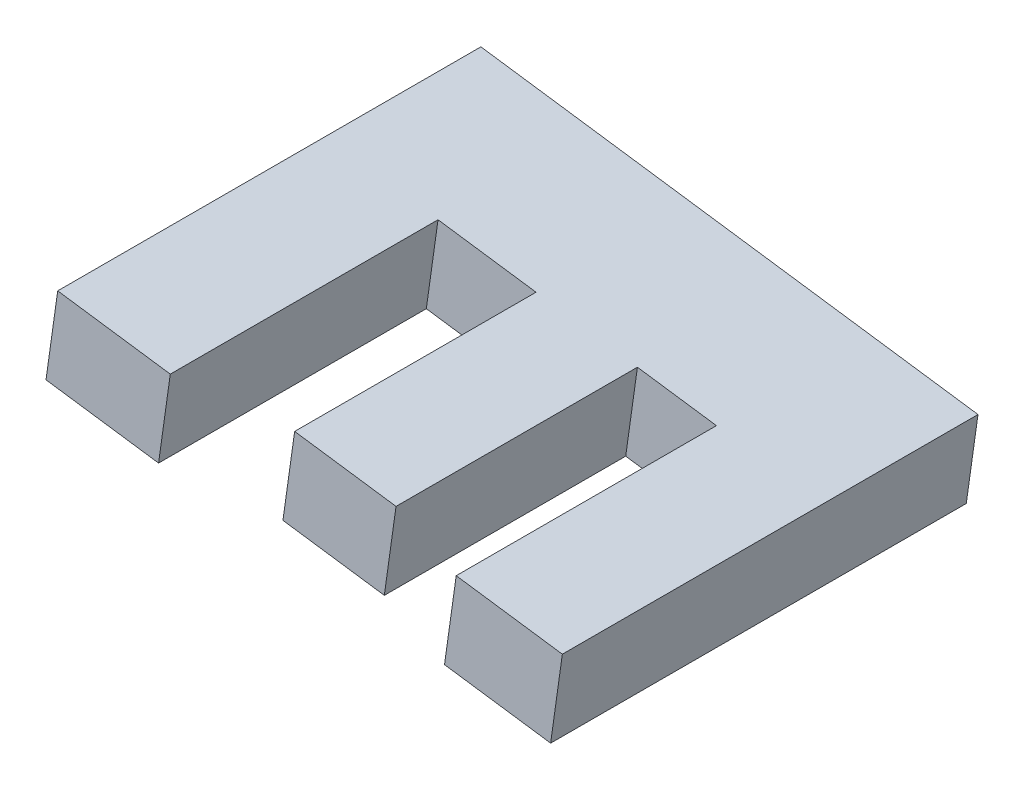
ISO-10303-21;
HEADER;
FILE_DESCRIPTION(('STEP AP214'),'2;1');
FILE_NAME('part.step','',(''),(''),'','','');
FILE_SCHEMA(('AUTOMOTIVE_DESIGN { 1 0 10303 214 1 1 1 1 }'));
ENDSEC;
DATA;
#1=APPLICATION_CONTEXT('core data for automotive mechanical design processes');
#2=APPLICATION_PROTOCOL_DEFINITION('international standard','automotive_design',2000,#1);
#3=PRODUCT_CONTEXT('',#1,'mechanical');
#4=PRODUCT('Part','Part','',(#3));
#5=PRODUCT_RELATED_PRODUCT_CATEGORY('part','',(#4));
#6=PRODUCT_DEFINITION_FORMATION('','',#4);
#7=PRODUCT_DEFINITION_CONTEXT('part definition',#1,'design');
#8=PRODUCT_DEFINITION('design','',#6,#7);
#9=PRODUCT_DEFINITION_SHAPE('','',#8);
#10=(LENGTH_UNIT() NAMED_UNIT(*) SI_UNIT(.MILLI.,.METRE.));
#11=(NAMED_UNIT(*) PLANE_ANGLE_UNIT() SI_UNIT($,.RADIAN.));
#12=(NAMED_UNIT(*) SI_UNIT($,.STERADIAN.) SOLID_ANGLE_UNIT());
#13=UNCERTAINTY_MEASURE_WITH_UNIT(LENGTH_MEASURE(1.E-05),#10,'distance_accuracy_value','');
#14=(GEOMETRIC_REPRESENTATION_CONTEXT(3) GLOBAL_UNCERTAINTY_ASSIGNED_CONTEXT((#13)) GLOBAL_UNIT_ASSIGNED_CONTEXT((#10,
#11,#12)) REPRESENTATION_CONTEXT('',''));
#15=CARTESIAN_POINT('',(0.,0.,0.));
#16=DIRECTION('',(0.,0.,1.));
#17=DIRECTION('',(1.,0.,0.));
#18=AXIS2_PLACEMENT_3D('',#15,#16,#17);
#19=CARTESIAN_POINT('',(740.126097386301,631.787182805213,1787.81099454484));
#20=DIRECTION('',(0.990268068741567,-0.139173100960088,0.));
#21=DIRECTION('',(-0.000106014336864278,-0.000754331202662602,-0.999999709872657));
#22=AXIS2_PLACEMENT_3D('',#19,#20,#21);
#23=PLANE('',#22);
#24=CARTESIAN_POINT('',(738.734366780479,621.884504990836,1787.81861198931));
#25=CARTESIAN_POINT('',(738.737000506365,621.903244924261,1812.66171528641));
#26=CARTESIAN_POINT('',(738.739634232251,621.921984857686,1837.50481858353));
#27=B_SPLINE_CURVE_WITH_KNOTS('',2,(#24,#25,#26),.UNSPECIFIED.,.F.,.F.,(3,3),(0.,1.),.UNSPECIFIED.);
#28=CARTESIAN_POINT('',(738.734366780479,621.884504990836,1787.81861198931));
#29=VERTEX_POINT('',#28);
#30=CARTESIAN_POINT('',(738.739634232251,621.921984857686,1837.50481858353));
#31=VERTEX_POINT('',#30);
#32=EDGE_CURVE('E146',#29,#31,#27,.T.);
#33=ORIENTED_EDGE('',*,*,#32,.F.);
#34=DIRECTION('',(-0.139173060582166,-0.990267781437723,0.000761744447259827));
#35=VECTOR('',#34,1.);
#36=CARTESIAN_POINT('',(740.126097386301,631.787182805213,1787.81099454484));
#37=LINE('',#36,#35);
#38=CARTESIAN_POINT('',(740.126097386301,631.787182805213,1787.81099454484));
#39=VERTEX_POINT('',#38);
#40=EDGE_CURVE('E33',#39,#29,#37,.T.);
#41=ORIENTED_EDGE('',*,*,#40,.F.);
#42=CARTESIAN_POINT('',(740.126097386301,631.787182805213,1787.81099454484));
#43=CARTESIAN_POINT('',(740.128731112187,631.805922738638,1812.65409784195));
#44=CARTESIAN_POINT('',(740.131364838072,631.824662672063,1837.49720113905));
#45=B_SPLINE_CURVE_WITH_KNOTS('',2,(#42,#43,#44),.UNSPECIFIED.,.F.,.F.,(3,3),(0.,1.),.UNSPECIFIED.);
#46=CARTESIAN_POINT('',(740.131364838072,631.824662672063,1837.49720113905));
#47=VERTEX_POINT('',#46);
#48=EDGE_CURVE('E238',#39,#47,#45,.T.);
#49=ORIENTED_EDGE('',*,*,#48,.T.);
#50=DIRECTION('',(-0.139173060582166,-0.990267781437723,0.000761744447259827));
#51=VECTOR('',#50,1.);
#52=CARTESIAN_POINT('',(740.131364838072,631.824662672063,1837.49720113905));
#53=LINE('',#52,#51);
#54=EDGE_CURVE('E11',#47,#31,#53,.T.);
#55=ORIENTED_EDGE('',*,*,#54,.T.);
#56=EDGE_LOOP('',(#33,#41,#49,#55));
#57=FACE_BOUND('',#56,.T.);
#58=ADVANCED_FACE('F17',(#57),#23,.T.);
#59=CARTESIAN_POINT('',(740.131364838072,631.824662672063,1837.49720113905));
#60=DIRECTION('',(0.000106014336864278,0.000754331202662602,0.999999709872657));
#61=DIRECTION('',(0.990268068741567,-0.139173100960088,0.));
#62=AXIS2_PLACEMENT_3D('',#59,#60,#61);
#63=PLANE('',#62);
#64=CARTESIAN_POINT('',(738.739634232251,621.921984857686,1837.50481858353));
#65=CARTESIAN_POINT('',(732.396784869711,622.813414201489,1837.50481858353));
#66=CARTESIAN_POINT('',(726.053935507171,623.704843545292,1837.50481858353));
#67=B_SPLINE_CURVE_WITH_KNOTS('',2,(#64,#65,#66),.UNSPECIFIED.,.F.,.F.,(3,3),(1.,2.),.UNSPECIFIED.);
#68=CARTESIAN_POINT('',(726.053935507171,623.704843545292,1837.50481858353));
#69=VERTEX_POINT('',#68);
#70=EDGE_CURVE('E154',#31,#69,#67,.T.);
#71=ORIENTED_EDGE('',*,*,#70,.F.);
#72=ORIENTED_EDGE('',*,*,#54,.F.);
#73=CARTESIAN_POINT('',(740.131364838072,631.824662672063,1837.49720113905));
#74=CARTESIAN_POINT('',(733.788515475533,632.716092015866,1837.49720113905));
#75=CARTESIAN_POINT('',(727.445666112993,633.607521359669,1837.49720113905));
#76=B_SPLINE_CURVE_WITH_KNOTS('',2,(#73,#74,#75),.UNSPECIFIED.,.F.,.F.,(3,3),(1.,2.),.UNSPECIFIED.);
#77=CARTESIAN_POINT('',(727.445666112993,633.607521359669,1837.49720113905));
#78=VERTEX_POINT('',#77);
#79=EDGE_CURVE('E258',#47,#78,#76,.T.);
#80=ORIENTED_EDGE('',*,*,#79,.T.);
#81=DIRECTION('',(-0.139173060582166,-0.990267781437723,0.000761744447259827));
#82=VECTOR('',#81,1.);
#83=CARTESIAN_POINT('',(727.445666112993,633.607521359669,1837.49720113905));
#84=LINE('',#83,#82);
#85=EDGE_CURVE('E25',#78,#69,#84,.T.);
#86=ORIENTED_EDGE('',*,*,#85,.T.);
#87=EDGE_LOOP('',(#71,#72,#80,#86));
#88=FACE_BOUND('',#87,.T.);
#89=ADVANCED_FACE('F257',(#88),#63,.T.);
#90=CARTESIAN_POINT('',(727.445666112993,633.607521359669,1837.49720113905));
#91=DIRECTION('',(-0.990268068741567,0.139173100960088,0.));
#92=DIRECTION('',(0.000106014336867813,0.000754331202662105,0.999999709872657));
#93=AXIS2_PLACEMENT_3D('',#90,#91,#92);
#94=PLANE('',#93);
#95=CARTESIAN_POINT('',(726.053935507171,623.704843545292,1837.50481858353));
#96=CARTESIAN_POINT('',(726.052286716666,623.693111791253,1821.95229922125));
#97=CARTESIAN_POINT('',(726.050637926161,623.681380037215,1806.39977985897));
#98=B_SPLINE_CURVE_WITH_KNOTS('',2,(#95,#96,#97),.UNSPECIFIED.,.F.,.F.,(3,3),(2.,3.),.UNSPECIFIED.);
#99=CARTESIAN_POINT('',(726.050637926161,623.681380037215,1806.39977985897));
#100=VERTEX_POINT('',#99);
#101=EDGE_CURVE('E162',#69,#100,#98,.T.);
#102=ORIENTED_EDGE('',*,*,#101,.F.);
#103=ORIENTED_EDGE('',*,*,#85,.F.);
#104=CARTESIAN_POINT('',(727.445666112993,633.607521359669,1837.49720113905));
#105=CARTESIAN_POINT('',(727.444017322488,633.59578960563,1821.94468177678));
#106=CARTESIAN_POINT('',(727.442368531983,633.584057851592,1806.3921624145));
#107=B_SPLINE_CURVE_WITH_KNOTS('',2,(#104,#105,#106),.UNSPECIFIED.,.F.,.F.,(3,3),(2.,3.),.UNSPECIFIED.);
#108=CARTESIAN_POINT('',(727.442368531983,633.584057851592,1806.3921624145));
#109=VERTEX_POINT('',#108);
#110=EDGE_CURVE('E267',#78,#109,#107,.T.);
#111=ORIENTED_EDGE('',*,*,#110,.T.);
#112=DIRECTION('',(-0.139173060582166,-0.990267781437723,0.000761744447259827));
#113=VECTOR('',#112,1.);
#114=CARTESIAN_POINT('',(727.442368531983,633.584057851592,1806.3921624145));
#115=LINE('',#114,#113);
#116=EDGE_CURVE('E255',#109,#100,#115,.T.);
#117=ORIENTED_EDGE('',*,*,#116,.T.);
#118=EDGE_LOOP('',(#102,#103,#111,#117));
#119=FACE_BOUND('',#118,.T.);
#120=ADVANCED_FACE('F262',(#119),#94,.T.);
#121=CARTESIAN_POINT('',(727.442368531983,633.584057851592,1806.3921624145));
#122=DIRECTION('',(0.000106014336864278,0.000754331202662602,0.999999709872657));
#123=DIRECTION('',(0.990268068741567,-0.139173100960088,0.));
#124=AXIS2_PLACEMENT_3D('',#121,#122,#123);
#125=PLANE('',#124);
#126=CARTESIAN_POINT('',(726.050637926161,623.681380037215,1806.39977985897));
#127=CARTESIAN_POINT('',(721.328964119542,624.344968015189,1806.39977985897));
#128=CARTESIAN_POINT('',(716.607290312923,625.008555993164,1806.39977985897));
#129=B_SPLINE_CURVE_WITH_KNOTS('',2,(#126,#127,#128),.UNSPECIFIED.,.F.,.F.,(3,3),(3.,4.),.UNSPECIFIED.);
#130=CARTESIAN_POINT('',(716.607290312923,625.008555993164,1806.39977985897));
#131=VERTEX_POINT('',#130);
#132=EDGE_CURVE('E170',#100,#131,#129,.T.);
#133=ORIENTED_EDGE('',*,*,#132,.F.);
#134=ORIENTED_EDGE('',*,*,#116,.F.);
#135=CARTESIAN_POINT('',(727.442368531983,633.584057851592,1806.3921624145));
#136=CARTESIAN_POINT('',(722.720694725364,634.247645829567,1806.3921624145));
#137=CARTESIAN_POINT('',(717.999020918745,634.911233807541,1806.3921624145));
#138=B_SPLINE_CURVE_WITH_KNOTS('',2,(#135,#136,#137),.UNSPECIFIED.,.F.,.F.,(3,3),(3.,4.),.UNSPECIFIED.);
#139=CARTESIAN_POINT('',(717.999020918745,634.911233807541,1806.3921624145));
#140=VERTEX_POINT('',#139);
#141=EDGE_CURVE('E283',#109,#140,#138,.T.);
#142=ORIENTED_EDGE('',*,*,#141,.T.);
#143=DIRECTION('',(-0.139173060582166,-0.990267781437723,0.000761744447259827));
#144=VECTOR('',#143,1.);
#145=CARTESIAN_POINT('',(717.999020918745,634.911233807541,1806.3921624145));
#146=LINE('',#145,#144);
#147=EDGE_CURVE('E253',#140,#131,#146,.T.);
#148=ORIENTED_EDGE('',*,*,#147,.T.);
#149=EDGE_LOOP('',(#133,#134,#142,#148));
#150=FACE_BOUND('',#149,.T.);
#151=ADVANCED_FACE('F351',(#150),#125,.T.);
#152=CARTESIAN_POINT('',(717.999020918745,634.911233807541,1806.3921624145));
#153=DIRECTION('',(0.990268068741567,-0.139173100960088,0.));
#154=DIRECTION('',(-0.000106014336864278,-0.000754331202662602,-0.999999709872657));
#155=AXIS2_PLACEMENT_3D('',#152,#153,#154);
#156=PLANE('',#155);
#157=CARTESIAN_POINT('',(716.607290312923,625.008555993164,1806.39977985897));
#158=CARTESIAN_POINT('',(716.608819783063,625.019438738687,1820.82678795161));
#159=CARTESIAN_POINT('',(716.610349253202,625.03032148421,1835.25379604425));
#160=B_SPLINE_CURVE_WITH_KNOTS('',2,(#157,#158,#159),.UNSPECIFIED.,.F.,.F.,(3,3),(4.,5.),.UNSPECIFIED.);
#161=CARTESIAN_POINT('',(716.610349253202,625.03032148421,1835.25379604425));
#162=VERTEX_POINT('',#161);
#163=EDGE_CURVE('E178',#131,#162,#160,.T.);
#164=ORIENTED_EDGE('',*,*,#163,.F.);
#165=ORIENTED_EDGE('',*,*,#147,.F.);
#166=CARTESIAN_POINT('',(717.999020918745,634.911233807541,1806.3921624145));
#167=CARTESIAN_POINT('',(718.000550388884,634.922116553064,1820.81917050714));
#168=CARTESIAN_POINT('',(718.002079859024,634.932999298587,1835.24617859977));
#169=B_SPLINE_CURVE_WITH_KNOTS('',2,(#166,#167,#168),.UNSPECIFIED.,.F.,.F.,(3,3),(4.,5.),.UNSPECIFIED.);
#170=CARTESIAN_POINT('',(718.002079859024,634.932999298587,1835.24617859977));
#171=VERTEX_POINT('',#170);
#172=EDGE_CURVE('E291',#140,#171,#169,.T.);
#173=ORIENTED_EDGE('',*,*,#172,.T.);
#174=DIRECTION('',(-0.139173060582166,-0.990267781437723,0.000761744447259827));
#175=VECTOR('',#174,1.);
#176=CARTESIAN_POINT('',(718.002079859024,634.932999298587,1835.24617859977));
#177=LINE('',#176,#175);
#178=EDGE_CURVE('E251',#171,#162,#177,.T.);
#179=ORIENTED_EDGE('',*,*,#178,.T.);
#180=EDGE_LOOP('',(#164,#165,#173,#179));
#181=FACE_BOUND('',#180,.T.);
#182=ADVANCED_FACE('F349',(#181),#156,.T.);
#183=CARTESIAN_POINT('',(718.002079859024,634.932999298587,1835.24617859977));
#184=DIRECTION('',(0.000106014336864278,0.000754331202662602,0.999999709872657));
#185=DIRECTION('',(0.990268068741567,-0.139173100960088,0.));
#186=AXIS2_PLACEMENT_3D('',#183,#184,#185);
#187=PLANE('',#186);
#188=CARTESIAN_POINT('',(716.610349253202,625.03032148421,1835.25379604425));
#189=CARTESIAN_POINT('',(710.551205612949,625.881878588993,1835.25379604425));
#190=CARTESIAN_POINT('',(704.492061972695,626.733435693776,1835.25379604425));
#191=B_SPLINE_CURVE_WITH_KNOTS('',2,(#188,#189,#190),.UNSPECIFIED.,.F.,.F.,(3,3),(5.,6.),.UNSPECIFIED.);
#192=CARTESIAN_POINT('',(704.492061972695,626.733435693776,1835.25379604425));
#193=VERTEX_POINT('',#192);
#194=EDGE_CURVE('E186',#162,#193,#191,.T.);
#195=ORIENTED_EDGE('',*,*,#194,.F.);
#196=ORIENTED_EDGE('',*,*,#178,.F.);
#197=CARTESIAN_POINT('',(718.002079859024,634.932999298587,1835.24617859977));
#198=CARTESIAN_POINT('',(711.94293621877,635.78455640337,1835.24617859977));
#199=CARTESIAN_POINT('',(705.883792578517,636.636113508153,1835.24617859977));
#200=B_SPLINE_CURVE_WITH_KNOTS('',2,(#197,#198,#199),.UNSPECIFIED.,.F.,.F.,(3,3),(5.,6.),.UNSPECIFIED.);
#201=CARTESIAN_POINT('',(705.883792578517,636.636113508153,1835.24617859977));
#202=VERTEX_POINT('',#201);
#203=EDGE_CURVE('E299',#171,#202,#200,.T.);
#204=ORIENTED_EDGE('',*,*,#203,.T.);
#205=DIRECTION('',(-0.139173060582166,-0.990267781437723,0.000761744447259827));
#206=VECTOR('',#205,1.);
#207=CARTESIAN_POINT('',(705.883792578517,636.636113508153,1835.24617859977));
#208=LINE('',#207,#206);
#209=EDGE_CURVE('E249',#202,#193,#208,.T.);
#210=ORIENTED_EDGE('',*,*,#209,.T.);
#211=EDGE_LOOP('',(#195,#196,#204,#210));
#212=FACE_BOUND('',#211,.T.);
#213=ADVANCED_FACE('F344',(#212),#187,.T.);
#214=CARTESIAN_POINT('',(705.883792578517,636.636113508153,1835.24617859977));
#215=DIRECTION('',(-0.990268068741567,0.139173100960088,0.));
#216=DIRECTION('',(0.000106014336868088,0.000754331202662066,0.999999709872657));
#217=AXIS2_PLACEMENT_3D('',#214,#215,#216);
#218=PLANE('',#217);
#219=CARTESIAN_POINT('',(704.492061972695,626.733435693776,1835.25379604425));
#220=CARTESIAN_POINT('',(704.490532502555,626.722552948253,1820.82678795161));
#221=CARTESIAN_POINT('',(704.489003032416,626.71167020273,1806.39977985897));
#222=B_SPLINE_CURVE_WITH_KNOTS('',2,(#219,#220,#221),.UNSPECIFIED.,.F.,.F.,(3,3),(6.,7.),.UNSPECIFIED.);
#223=CARTESIAN_POINT('',(704.489003032416,626.71167020273,1806.39977985897));
#224=VERTEX_POINT('',#223);
#225=EDGE_CURVE('E194',#193,#224,#222,.T.);
#226=ORIENTED_EDGE('',*,*,#225,.F.);
#227=ORIENTED_EDGE('',*,*,#209,.F.);
#228=CARTESIAN_POINT('',(705.883792578517,636.636113508153,1835.24617859977));
#229=CARTESIAN_POINT('',(705.882263108377,636.62523076263,1820.81917050714));
#230=CARTESIAN_POINT('',(705.880733638237,636.614348017108,1806.3921624145));
#231=B_SPLINE_CURVE_WITH_KNOTS('',2,(#228,#229,#230),.UNSPECIFIED.,.F.,.F.,(3,3),(6.,7.),.UNSPECIFIED.);
#232=CARTESIAN_POINT('',(705.880733638237,636.614348017108,1806.3921624145));
#233=VERTEX_POINT('',#232);
#234=EDGE_CURVE('E307',#202,#233,#231,.T.);
#235=ORIENTED_EDGE('',*,*,#234,.T.);
#236=DIRECTION('',(-0.139173060582166,-0.990267781437723,0.000761744447259827));
#237=VECTOR('',#236,1.);
#238=CARTESIAN_POINT('',(705.880733638237,636.614348017108,1806.3921624145));
#239=LINE('',#238,#237);
#240=EDGE_CURVE('E247',#233,#224,#239,.T.);
#241=ORIENTED_EDGE('',*,*,#240,.T.);
#242=EDGE_LOOP('',(#226,#227,#235,#241));
#243=FACE_BOUND('',#242,.T.);
#244=ADVANCED_FACE('F341',(#243),#218,.T.);
#245=CARTESIAN_POINT('',(705.880733638237,636.614348017108,1806.3921624145));
#246=DIRECTION('',(0.000106014336864278,0.000754331202662602,0.999999709872657));
#247=DIRECTION('',(0.990268068741567,-0.139173100960088,0.));
#248=AXIS2_PLACEMENT_3D('',#245,#246,#247);
#249=PLANE('',#248);
#250=CARTESIAN_POINT('',(704.489003032416,626.71167020273,1806.39977985897));
#251=CARTESIAN_POINT('',(698.632506336652,627.534747136785,1806.39977985897));
#252=CARTESIAN_POINT('',(692.776009640889,628.357824070839,1806.39977985897));
#253=B_SPLINE_CURVE_WITH_KNOTS('',2,(#250,#251,#252),.UNSPECIFIED.,.F.,.F.,(3,3),(7.,8.),.UNSPECIFIED.);
#254=CARTESIAN_POINT('',(692.776009640889,628.357824070839,1806.39977985897));
#255=VERTEX_POINT('',#254);
#256=EDGE_CURVE('E202',#224,#255,#253,.T.);
#257=ORIENTED_EDGE('',*,*,#256,.F.);
#258=ORIENTED_EDGE('',*,*,#240,.F.);
#259=CARTESIAN_POINT('',(705.880733638237,636.614348017108,1806.3921624145));
#260=CARTESIAN_POINT('',(700.024236942474,637.437424951162,1806.3921624145));
#261=CARTESIAN_POINT('',(694.16774024671,638.260501885217,1806.3921624145));
#262=B_SPLINE_CURVE_WITH_KNOTS('',2,(#259,#260,#261),.UNSPECIFIED.,.F.,.F.,(3,3),(7.,8.),.UNSPECIFIED.);
#263=CARTESIAN_POINT('',(694.16774024671,638.260501885217,1806.3921624145));
#264=VERTEX_POINT('',#263);
#265=EDGE_CURVE('E315',#233,#264,#262,.T.);
#266=ORIENTED_EDGE('',*,*,#265,.T.);
#267=DIRECTION('',(-0.139173060582166,-0.990267781437723,0.000761744447259827));
#268=VECTOR('',#267,1.);
#269=CARTESIAN_POINT('',(694.16774024671,638.260501885217,1806.3921624145));
#270=LINE('',#269,#268);
#271=EDGE_CURVE('E245',#264,#255,#270,.T.);
#272=ORIENTED_EDGE('',*,*,#271,.T.);
#273=EDGE_LOOP('',(#257,#258,#266,#272));
#274=FACE_BOUND('',#273,.T.);
#275=ADVANCED_FACE('F338',(#274),#249,.T.);
#276=CARTESIAN_POINT('',(694.16774024671,638.260501885217,1806.3921624145));
#277=DIRECTION('',(0.990268068741567,-0.139173100960088,0.));
#278=DIRECTION('',(-0.000106014336864278,-0.000754331202662602,-0.999999709872657));
#279=AXIS2_PLACEMENT_3D('',#276,#277,#278);
#280=PLANE('',#279);
#281=CARTESIAN_POINT('',(692.776009640889,628.357824070839,1806.39977985897));
#282=CARTESIAN_POINT('',(692.77770615954,628.369895428284,1822.4025037291));
#283=CARTESIAN_POINT('',(692.779402678191,628.381966785729,1838.40522759924));
#284=B_SPLINE_CURVE_WITH_KNOTS('',2,(#281,#282,#283),.UNSPECIFIED.,.F.,.F.,(3,3),(8.,9.),.UNSPECIFIED.);
#285=CARTESIAN_POINT('',(692.779402678191,628.381966785729,1838.40522759924));
#286=VERTEX_POINT('',#285);
#287=EDGE_CURVE('E210',#255,#286,#284,.T.);
#288=ORIENTED_EDGE('',*,*,#287,.F.);
#289=ORIENTED_EDGE('',*,*,#271,.F.);
#290=CARTESIAN_POINT('',(694.16774024671,638.260501885217,1806.3921624145));
#291=CARTESIAN_POINT('',(694.169436765362,638.272573242662,1822.39488628464));
#292=CARTESIAN_POINT('',(694.171133284013,638.284644600107,1838.39761015477));
#293=B_SPLINE_CURVE_WITH_KNOTS('',2,(#290,#291,#292),.UNSPECIFIED.,.F.,.F.,(3,3),(8.,9.),.UNSPECIFIED.);
#294=CARTESIAN_POINT('',(694.171133284013,638.284644600107,1838.39761015477));
#295=VERTEX_POINT('',#294);
#296=EDGE_CURVE('E128',#264,#295,#293,.T.);
#297=ORIENTED_EDGE('',*,*,#296,.T.);
#298=DIRECTION('',(-0.139173060582166,-0.990267781437723,0.000761744447259827));
#299=VECTOR('',#298,1.);
#300=CARTESIAN_POINT('',(694.171133284013,638.284644600107,1838.39761015477));
#301=LINE('',#300,#299);
#302=EDGE_CURVE('E120',#295,#286,#301,.T.);
#303=ORIENTED_EDGE('',*,*,#302,.T.);
#304=EDGE_LOOP('',(#288,#289,#297,#303));
#305=FACE_BOUND('',#304,.T.);
#306=ADVANCED_FACE('F332',(#305),#280,.T.);
#307=CARTESIAN_POINT('',(694.171133284013,638.284644600107,1838.39761015477));
#308=DIRECTION('',(0.000106014336864278,0.000754331202662602,0.999999709872657));
#309=DIRECTION('',(0.990268068741567,-0.139173100960088,0.));
#310=AXIS2_PLACEMENT_3D('',#307,#308,#309);
#311=PLANE('',#310);
#312=CARTESIAN_POINT('',(692.779402678191,628.381966785729,1838.40522759924));
#313=CARTESIAN_POINT('',(686.05152412112,629.327508453917,1838.40522759924));
#314=CARTESIAN_POINT('',(679.323645564049,630.273050122104,1838.40522759924));
#315=B_SPLINE_CURVE_WITH_KNOTS('',2,(#312,#313,#314),.UNSPECIFIED.,.F.,.F.,(3,3),(9.,10.),.UNSPECIFIED.);
#316=CARTESIAN_POINT('',(679.323645564049,630.273050122104,1838.40522759924));
#317=VERTEX_POINT('',#316);
#318=EDGE_CURVE('E218',#286,#317,#315,.T.);
#319=ORIENTED_EDGE('',*,*,#318,.F.);
#320=ORIENTED_EDGE('',*,*,#302,.F.);
#321=CARTESIAN_POINT('',(694.171133284013,638.284644600107,1838.39761015477));
#322=CARTESIAN_POINT('',(687.443254726942,639.230186268294,1838.39761015477));
#323=CARTESIAN_POINT('',(680.715376169871,640.175727936481,1838.39761015477));
#324=B_SPLINE_CURVE_WITH_KNOTS('',2,(#321,#322,#323),.UNSPECIFIED.,.F.,.F.,(3,3),(9.,10.),.UNSPECIFIED.);
#325=CARTESIAN_POINT('',(680.715376169871,640.175727936481,1838.39761015477));
#326=VERTEX_POINT('',#325);
#327=EDGE_CURVE('E123',#295,#326,#324,.T.);
#328=ORIENTED_EDGE('',*,*,#327,.T.);
#329=DIRECTION('',(-0.139173060582166,-0.990267781437723,0.000761744447259827));
#330=VECTOR('',#329,1.);
#331=CARTESIAN_POINT('',(680.715376169871,640.175727936481,1838.39761015477));
#332=LINE('',#331,#330);
#333=EDGE_CURVE('E109',#326,#317,#332,.T.);
#334=ORIENTED_EDGE('',*,*,#333,.T.);
#335=EDGE_LOOP('',(#319,#320,#328,#334));
#336=FACE_BOUND('',#335,.T.);
#337=ADVANCED_FACE('F124',(#336),#311,.T.);
#338=CARTESIAN_POINT('',(680.715376169871,640.175727936481,1838.39761015477));
#339=DIRECTION('',(-0.990268068741567,0.139173100960088,0.));
#340=DIRECTION('',(0.000106014336862105,0.000754331202662907,0.999999709872657));
#341=AXIS2_PLACEMENT_3D('',#338,#339,#340);
#342=PLANE('',#341);
#343=CARTESIAN_POINT('',(679.323645564049,630.273050122104,1838.40522759924));
#344=CARTESIAN_POINT('',(679.320964110017,630.253970585273,1813.11191979428));
#345=CARTESIAN_POINT('',(679.318282655985,630.234891048441,1787.81861198931));
#346=B_SPLINE_CURVE_WITH_KNOTS('',2,(#343,#344,#345),.UNSPECIFIED.,.F.,.F.,(3,3),(10.,11.),.UNSPECIFIED.);
#347=CARTESIAN_POINT('',(679.318282655985,630.234891048441,1787.81861198931));
#348=VERTEX_POINT('',#347);
#349=EDGE_CURVE('E116',#317,#348,#346,.T.);
#350=ORIENTED_EDGE('',*,*,#349,.F.);
#351=ORIENTED_EDGE('',*,*,#333,.F.);
#352=CARTESIAN_POINT('',(680.715376169871,640.175727936481,1838.39761015477));
#353=CARTESIAN_POINT('',(680.712694715839,640.15664839965,1813.1043023498));
#354=CARTESIAN_POINT('',(680.710013261807,640.137568862819,1787.81099454484));
#355=B_SPLINE_CURVE_WITH_KNOTS('',2,(#352,#353,#354),.UNSPECIFIED.,.F.,.F.,(3,3),(10.,11.),.UNSPECIFIED.);
#356=CARTESIAN_POINT('',(680.710013261807,640.137568862819,1787.81099454484));
#357=VERTEX_POINT('',#356);
#358=EDGE_CURVE('E113',#326,#357,#355,.T.);
#359=ORIENTED_EDGE('',*,*,#358,.T.);
#360=DIRECTION('',(-0.139173060582166,-0.990267781437723,0.000761744447259827));
#361=VECTOR('',#360,1.);
#362=CARTESIAN_POINT('',(680.710013261807,640.137568862819,1787.81099454484));
#363=LINE('',#362,#361);
#364=EDGE_CURVE('E73',#357,#348,#363,.T.);
#365=ORIENTED_EDGE('',*,*,#364,.T.);
#366=EDGE_LOOP('',(#350,#351,#359,#365));
#367=FACE_BOUND('',#366,.T.);
#368=ADVANCED_FACE('F111',(#367),#342,.T.);
#369=CARTESIAN_POINT('',(680.710013261807,640.137568862819,1787.81099454484));
#370=DIRECTION('',(-0.000106014336864278,-0.000754331202662602,-0.999999709872657));
#371=DIRECTION('',(-0.990268068741567,0.139173100960088,0.));
#372=AXIS2_PLACEMENT_3D('',#369,#370,#371);
#373=PLANE('',#372);
#374=CARTESIAN_POINT('',(679.318282655985,630.234891048441,1787.81861198931));
#375=CARTESIAN_POINT('',(709.026324718232,626.059698019639,1787.81861198931));
#376=CARTESIAN_POINT('',(738.734366780479,621.884504990836,1787.81861198931));
#377=B_SPLINE_CURVE_WITH_KNOTS('',2,(#374,#375,#376),.UNSPECIFIED.,.F.,.F.,(3,3),(11.,12.),.UNSPECIFIED.);
#378=EDGE_CURVE('E231',#348,#29,#377,.T.);
#379=ORIENTED_EDGE('',*,*,#378,.F.);
#380=ORIENTED_EDGE('',*,*,#364,.F.);
#381=CARTESIAN_POINT('',(680.710013261807,640.137568862819,1787.81099454484));
#382=CARTESIAN_POINT('',(710.418055324054,635.962375834016,1787.81099454484));
#383=CARTESIAN_POINT('',(740.126097386301,631.787182805213,1787.81099454484));
#384=B_SPLINE_CURVE_WITH_KNOTS('',2,(#381,#382,#383),.UNSPECIFIED.,.F.,.F.,(3,3),(11.,12.),.UNSPECIFIED.);
#385=EDGE_CURVE('E132',#357,#39,#384,.T.);
#386=ORIENTED_EDGE('',*,*,#385,.T.);
#387=ORIENTED_EDGE('',*,*,#40,.T.);
#388=EDGE_LOOP('',(#379,#380,#386,#387));
#389=FACE_BOUND('',#388,.T.);
#390=ADVANCED_FACE('F438',(#389),#373,.T.);
#391=CARTESIAN_POINT('',(740.128731112187,631.805922738638,1812.65409784195));
#392=DIRECTION('',(0.139173060582166,0.990267781437723,-0.000761744447259827));
#393=DIRECTION('',(0.000106014336864278,0.000754331202662602,0.999999709872657));
#394=AXIS2_PLACEMENT_3D('',#391,#392,#393);
#395=PLANE('',#394);
#396=ORIENTED_EDGE('',*,*,#48,.F.);
#397=ORIENTED_EDGE('',*,*,#385,.F.);
#398=ORIENTED_EDGE('',*,*,#358,.F.);
#399=ORIENTED_EDGE('',*,*,#327,.F.);
#400=ORIENTED_EDGE('',*,*,#296,.F.);
#401=ORIENTED_EDGE('',*,*,#265,.F.);
#402=ORIENTED_EDGE('',*,*,#234,.F.);
#403=ORIENTED_EDGE('',*,*,#203,.F.);
#404=ORIENTED_EDGE('',*,*,#172,.F.);
#405=ORIENTED_EDGE('',*,*,#141,.F.);
#406=ORIENTED_EDGE('',*,*,#110,.F.);
#407=ORIENTED_EDGE('',*,*,#79,.F.);
#408=EDGE_LOOP('',(#396,#397,#398,#399,#400,#401,#402,#403,#404,#405,#406,#407));
#409=FACE_BOUND('',#408,.T.);
#410=ADVANCED_FACE('F131',(#409),#395,.T.);
#411=CARTESIAN_POINT('',(738.737000506365,621.903244924261,1812.66171528641));
#412=DIRECTION('',(0.139173060582166,0.990267781437723,-0.000761744447259827));
#413=DIRECTION('',(0.000106014336864278,0.000754331202662602,0.999999709872657));
#414=AXIS2_PLACEMENT_3D('',#411,#412,#413);
#415=PLANE('',#414);
#416=ORIENTED_EDGE('',*,*,#32,.T.);
#417=ORIENTED_EDGE('',*,*,#70,.T.);
#418=ORIENTED_EDGE('',*,*,#101,.T.);
#419=ORIENTED_EDGE('',*,*,#132,.T.);
#420=ORIENTED_EDGE('',*,*,#163,.T.);
#421=ORIENTED_EDGE('',*,*,#194,.T.);
#422=ORIENTED_EDGE('',*,*,#225,.T.);
#423=ORIENTED_EDGE('',*,*,#256,.T.);
#424=ORIENTED_EDGE('',*,*,#287,.T.);
#425=ORIENTED_EDGE('',*,*,#318,.T.);
#426=ORIENTED_EDGE('',*,*,#349,.T.);
#427=ORIENTED_EDGE('',*,*,#378,.T.);
#428=EDGE_LOOP('',(#416,#417,#418,#419,#420,#421,#422,#423,#424,#425,#426,#427));
#429=FACE_BOUND('',#428,.T.);
#430=ADVANCED_FACE('F265',(#429),#415,.F.);
#431=CLOSED_SHELL('',(#58,#89,#120,#151,#182,#213,#244,#275,#306,#337,#368,#390,#410,#430));
#432=MANIFOLD_SOLID_BREP('B1',#431);
#433=ADVANCED_BREP_SHAPE_REPRESENTATION('',(#18,#432),#14);
#434=SHAPE_DEFINITION_REPRESENTATION(#9,#433);
ENDSEC;
END-ISO-10303-21;
